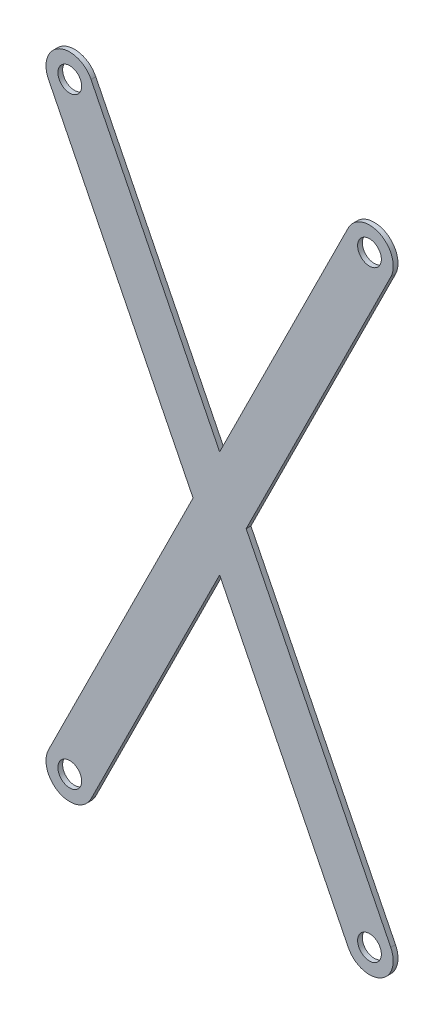
ISO-10303-21;
HEADER;
FILE_DESCRIPTION(('STEP AP214'),'2;1');
FILE_NAME('part.step','',(''),(''),'','','');
FILE_SCHEMA(('AUTOMOTIVE_DESIGN { 1 0 10303 214 1 1 1 1 }'));
ENDSEC;
DATA;
#1=APPLICATION_CONTEXT('core data for automotive mechanical design processes');
#2=APPLICATION_PROTOCOL_DEFINITION('international standard','automotive_design',2000,#1);
#3=PRODUCT_CONTEXT('',#1,'mechanical');
#4=PRODUCT('Part','Part','',(#3));
#5=PRODUCT_RELATED_PRODUCT_CATEGORY('part','',(#4));
#6=PRODUCT_DEFINITION_FORMATION('','',#4);
#7=PRODUCT_DEFINITION_CONTEXT('part definition',#1,'design');
#8=PRODUCT_DEFINITION('design','',#6,#7);
#9=PRODUCT_DEFINITION_SHAPE('','',#8);
#10=(LENGTH_UNIT() NAMED_UNIT(*) SI_UNIT(.MILLI.,.METRE.));
#11=(NAMED_UNIT(*) PLANE_ANGLE_UNIT() SI_UNIT($,.RADIAN.));
#12=(NAMED_UNIT(*) SI_UNIT($,.STERADIAN.) SOLID_ANGLE_UNIT());
#13=UNCERTAINTY_MEASURE_WITH_UNIT(LENGTH_MEASURE(1.E-05),#10,'distance_accuracy_value','');
#14=(GEOMETRIC_REPRESENTATION_CONTEXT(3) GLOBAL_UNCERTAINTY_ASSIGNED_CONTEXT((#13)) GLOBAL_UNIT_ASSIGNED_CONTEXT((#10,
#11,#12)) REPRESENTATION_CONTEXT('',''));
#15=CARTESIAN_POINT('',(0.,0.,0.));
#16=DIRECTION('',(0.,0.,1.));
#17=DIRECTION('',(1.,0.,0.));
#18=AXIS2_PLACEMENT_3D('',#15,#16,#17);
#19=CARTESIAN_POINT('',(0.,0.,3.));
#20=DIRECTION('',(0.,0.,1.));
#21=DIRECTION('',(1.,0.,0.));
#22=AXIS2_PLACEMENT_3D('',#19,#20,#21);
#23=PLANE('',#22);
#24=CARTESIAN_POINT('',(189.2634,-2.22044604925031E-13,3.));
#25=DIRECTION('',(0.,0.,1.));
#26=DIRECTION('',(1.,0.,0.));
#27=AXIS2_PLACEMENT_3D('',#24,#25,#26);
#28=CIRCLE('',#27,7.50000000000001);
#29=CARTESIAN_POINT('',(196.7634,-2.22044604925031E-13,3.));
#30=VERTEX_POINT('',#29);
#31=EDGE_CURVE('E293',#30,#30,#28,.T.);
#32=ORIENTED_EDGE('',*,*,#31,.F.);
#33=EDGE_LOOP('',(#32));
#34=FACE_BOUND('',#33,.T.);
#35=CARTESIAN_POINT('',(0.,-2.22044604925031E-13,3.));
#36=DIRECTION('',(0.,0.,1.));
#37=DIRECTION('',(1.,0.,0.));
#38=AXIS2_PLACEMENT_3D('',#35,#36,#37);
#39=CIRCLE('',#38,7.5);
#40=CARTESIAN_POINT('',(7.50000000000003,-2.22044604925031E-13,3.));
#41=VERTEX_POINT('',#40);
#42=EDGE_CURVE('E160',#41,#41,#39,.T.);
#43=ORIENTED_EDGE('',*,*,#42,.F.);
#44=EDGE_LOOP('',(#43));
#45=FACE_BOUND('',#44,.T.);
#46=CARTESIAN_POINT('',(0.,0.,3.));
#47=DIRECTION('',(0.,0.,1.));
#48=DIRECTION('',(1.,0.,0.));
#49=AXIS2_PLACEMENT_3D('',#46,#47,#48);
#50=CIRCLE('',#49,15.);
#51=CARTESIAN_POINT('',(-13.4268024267936,6.68737441690315,3.));
#52=VERTEX_POINT('',#51);
#53=CARTESIAN_POINT('',(13.4268024267936,-6.68737441690315,3.));
#54=VERTEX_POINT('',#53);
#55=EDGE_CURVE('E179',#52,#54,#50,.T.);
#56=ORIENTED_EDGE('',*,*,#55,.T.);
#57=DIRECTION('',(0.445824961126876,0.895120161786237,0.));
#58=VECTOR('',#57,1.);
#59=CARTESIAN_POINT('',(13.4268024267936,-6.68737441690315,3.));
#60=LINE('',#59,#58);
#61=CARTESIAN_POINT('',(94.6316999999998,156.354508365602,3.));
#62=VERTEX_POINT('',#61);
#63=EDGE_CURVE('E107',#54,#62,#60,.T.);
#64=ORIENTED_EDGE('',*,*,#63,.T.);
#65=DIRECTION('',(0.445824961126877,-0.895120161786237,0.));
#66=VECTOR('',#65,1.);
#67=CARTESIAN_POINT('',(94.6316999999998,156.354508365602,3.));
#68=LINE('',#67,#66);
#69=CARTESIAN_POINT('',(175.836597573206,-6.68737441690336,3.));
#70=VERTEX_POINT('',#69);
#71=EDGE_CURVE('E206',#62,#70,#68,.T.);
#72=ORIENTED_EDGE('',*,*,#71,.T.);
#73=CARTESIAN_POINT('',(189.2634,-1.94289029309402E-13,3.));
#74=DIRECTION('',(0.,0.,1.));
#75=DIRECTION('',(1.,0.,0.));
#76=AXIS2_PLACEMENT_3D('',#73,#74,#75);
#77=CIRCLE('',#76,15.);
#78=CARTESIAN_POINT('',(202.690202426793,6.68737441690293,3.));
#79=VERTEX_POINT('',#78);
#80=EDGE_CURVE('E225',#70,#79,#77,.T.);
#81=ORIENTED_EDGE('',*,*,#80,.T.);
#82=DIRECTION('',(-0.445824961126877,0.895120161786237,0.));
#83=VECTOR('',#82,1.);
#84=CARTESIAN_POINT('',(111.389226687888,190.,3.));
#85=LINE('',#84,#83);
#86=CARTESIAN_POINT('',(111.389226687888,190.,3.));
#87=VERTEX_POINT('',#86);
#88=EDGE_CURVE('E222',#79,#87,#85,.T.);
#89=ORIENTED_EDGE('',*,*,#88,.T.);
#90=DIRECTION('',(0.445824961126876,0.895120161786237,0.));
#91=VECTOR('',#90,1.);
#92=CARTESIAN_POINT('',(111.389226687888,190.,3.));
#93=LINE('',#92,#91);
#94=CARTESIAN_POINT('',(202.690202426793,373.312625583097,3.));
#95=VERTEX_POINT('',#94);
#96=EDGE_CURVE('E224',#87,#95,#93,.T.);
#97=ORIENTED_EDGE('',*,*,#96,.T.);
#98=CARTESIAN_POINT('',(189.2634,380.,3.));
#99=DIRECTION('',(0.,0.,1.));
#100=DIRECTION('',(1.,0.,0.));
#101=AXIS2_PLACEMENT_3D('',#98,#99,#100);
#102=CIRCLE('',#101,15.);
#103=CARTESIAN_POINT('',(175.836597573206,386.687374416903,3.));
#104=VERTEX_POINT('',#103);
#105=EDGE_CURVE('E227',#95,#104,#102,.T.);
#106=ORIENTED_EDGE('',*,*,#105,.T.);
#107=DIRECTION('',(-0.445824961126876,-0.895120161786237,0.));
#108=VECTOR('',#107,1.);
#109=CARTESIAN_POINT('',(94.6316999999998,223.645491634397,3.));
#110=LINE('',#109,#108);
#111=CARTESIAN_POINT('',(94.6316999999998,223.645491634397,3.));
#112=VERTEX_POINT('',#111);
#113=EDGE_CURVE('E233',#104,#112,#110,.T.);
#114=ORIENTED_EDGE('',*,*,#113,.T.);
#115=DIRECTION('',(-0.445824961126877,0.895120161786237,0.));
#116=VECTOR('',#115,1.);
#117=CARTESIAN_POINT('',(13.4268024267935,386.687374416903,3.));
#118=LINE('',#117,#116);
#119=CARTESIAN_POINT('',(13.4268024267935,386.687374416903,3.));
#120=VERTEX_POINT('',#119);
#121=EDGE_CURVE('E138',#112,#120,#118,.T.);
#122=ORIENTED_EDGE('',*,*,#121,.T.);
#123=CARTESIAN_POINT('',(0.,380.,3.));
#124=DIRECTION('',(0.,0.,1.));
#125=DIRECTION('',(1.,0.,0.));
#126=AXIS2_PLACEMENT_3D('',#123,#124,#125);
#127=CIRCLE('',#126,15.);
#128=CARTESIAN_POINT('',(-13.4268024267936,373.312625583097,3.));
#129=VERTEX_POINT('',#128);
#130=EDGE_CURVE('E132',#120,#129,#127,.T.);
#131=ORIENTED_EDGE('',*,*,#130,.T.);
#132=DIRECTION('',(0.445824961126877,-0.895120161786237,0.));
#133=VECTOR('',#132,1.);
#134=CARTESIAN_POINT('',(-13.4268024267936,373.312625583097,3.));
#135=LINE('',#134,#133);
#136=CARTESIAN_POINT('',(77.8741733121112,190.,3.));
#137=VERTEX_POINT('',#136);
#138=EDGE_CURVE('E136',#129,#137,#135,.T.);
#139=ORIENTED_EDGE('',*,*,#138,.T.);
#140=DIRECTION('',(-0.445824961126876,-0.895120161786237,0.));
#141=VECTOR('',#140,1.);
#142=CARTESIAN_POINT('',(-13.4268024267936,6.68737441690315,3.));
#143=LINE('',#142,#141);
#144=EDGE_CURVE('E52',#137,#52,#143,.T.);
#145=ORIENTED_EDGE('',*,*,#144,.T.);
#146=EDGE_LOOP('',(#56,#64,#72,#81,#89,#97,#106,#114,#122,#131,#139,#145));
#147=FACE_BOUND('',#146,.T.);
#148=CARTESIAN_POINT('',(189.2634,380.,3.));
#149=DIRECTION('',(0.,0.,1.));
#150=DIRECTION('',(1.,0.,0.));
#151=AXIS2_PLACEMENT_3D('',#148,#149,#150);
#152=CIRCLE('',#151,7.50000000000001);
#153=CARTESIAN_POINT('',(196.7634,380.,3.));
#154=VERTEX_POINT('',#153);
#155=EDGE_CURVE('E299',#154,#154,#152,.T.);
#156=ORIENTED_EDGE('',*,*,#155,.F.);
#157=EDGE_LOOP('',(#156));
#158=FACE_BOUND('',#157,.T.);
#159=CARTESIAN_POINT('',(0.,380.,3.));
#160=DIRECTION('',(0.,0.,1.));
#161=DIRECTION('',(1.,0.,0.));
#162=AXIS2_PLACEMENT_3D('',#159,#160,#161);
#163=CIRCLE('',#162,7.5);
#164=CARTESIAN_POINT('',(7.49999999999992,380.,3.));
#165=VERTEX_POINT('',#164);
#166=EDGE_CURVE('E284',#165,#165,#163,.T.);
#167=ORIENTED_EDGE('',*,*,#166,.F.);
#168=EDGE_LOOP('',(#167));
#169=FACE_BOUND('',#168,.T.);
#170=ADVANCED_FACE('F35',(#34,#45,#147,#158,#169),#23,.T.);
#171=CARTESIAN_POINT('',(0.,0.,0.));
#172=DIRECTION('',(0.,0.,1.));
#173=DIRECTION('',(1.,0.,0.));
#174=AXIS2_PLACEMENT_3D('',#171,#172,#173);
#175=PLANE('',#174);
#176=CARTESIAN_POINT('',(0.,0.,0.));
#177=DIRECTION('',(0.,0.,1.));
#178=DIRECTION('',(1.,0.,0.));
#179=AXIS2_PLACEMENT_3D('',#176,#177,#178);
#180=CIRCLE('',#179,15.);
#181=CARTESIAN_POINT('',(-13.4268024267936,6.68737441690315,0.));
#182=VERTEX_POINT('',#181);
#183=CARTESIAN_POINT('',(13.4268024267936,-6.68737441690315,0.));
#184=VERTEX_POINT('',#183);
#185=EDGE_CURVE('E156',#182,#184,#180,.T.);
#186=ORIENTED_EDGE('',*,*,#185,.F.);
#187=DIRECTION('',(-0.445824961126876,-0.895120161786237,0.));
#188=VECTOR('',#187,1.);
#189=CARTESIAN_POINT('',(-13.4268024267936,6.68737441690315,0.));
#190=LINE('',#189,#188);
#191=CARTESIAN_POINT('',(77.8741733121112,190.,0.));
#192=VERTEX_POINT('',#191);
#193=EDGE_CURVE('E99',#192,#182,#190,.T.);
#194=ORIENTED_EDGE('',*,*,#193,.F.);
#195=DIRECTION('',(0.445824961126877,-0.895120161786237,0.));
#196=VECTOR('',#195,1.);
#197=CARTESIAN_POINT('',(-13.4268024267936,373.312625583097,0.));
#198=LINE('',#197,#196);
#199=CARTESIAN_POINT('',(-13.4268024267936,373.312625583097,0.));
#200=VERTEX_POINT('',#199);
#201=EDGE_CURVE('E93',#200,#192,#198,.T.);
#202=ORIENTED_EDGE('',*,*,#201,.F.);
#203=CARTESIAN_POINT('',(0.,380.,0.));
#204=DIRECTION('',(0.,0.,1.));
#205=DIRECTION('',(1.,0.,0.));
#206=AXIS2_PLACEMENT_3D('',#203,#204,#205);
#207=CIRCLE('',#206,15.);
#208=CARTESIAN_POINT('',(13.4268024267935,386.687374416903,0.));
#209=VERTEX_POINT('',#208);
#210=EDGE_CURVE('E146',#209,#200,#207,.T.);
#211=ORIENTED_EDGE('',*,*,#210,.F.);
#212=DIRECTION('',(-0.445824961126877,0.895120161786237,0.));
#213=VECTOR('',#212,1.);
#214=CARTESIAN_POINT('',(13.4268024267935,386.687374416903,0.));
#215=LINE('',#214,#213);
#216=CARTESIAN_POINT('',(94.6316999999998,223.645491634397,0.));
#217=VERTEX_POINT('',#216);
#218=EDGE_CURVE('E174',#217,#209,#215,.T.);
#219=ORIENTED_EDGE('',*,*,#218,.F.);
#220=DIRECTION('',(-0.445824961126876,-0.895120161786237,0.));
#221=VECTOR('',#220,1.);
#222=CARTESIAN_POINT('',(94.6316999999998,223.645491634397,0.));
#223=LINE('',#222,#221);
#224=CARTESIAN_POINT('',(175.836597573206,386.687374416903,0.));
#225=VERTEX_POINT('',#224);
#226=EDGE_CURVE('E172',#225,#217,#223,.T.);
#227=ORIENTED_EDGE('',*,*,#226,.F.);
#228=CARTESIAN_POINT('',(189.2634,380.,0.));
#229=DIRECTION('',(0.,0.,1.));
#230=DIRECTION('',(1.,0.,0.));
#231=AXIS2_PLACEMENT_3D('',#228,#229,#230);
#232=CIRCLE('',#231,15.);
#233=CARTESIAN_POINT('',(202.690202426793,373.312625583097,0.));
#234=VERTEX_POINT('',#233);
#235=EDGE_CURVE('E170',#234,#225,#232,.T.);
#236=ORIENTED_EDGE('',*,*,#235,.F.);
#237=DIRECTION('',(0.445824961126876,0.895120161786237,0.));
#238=VECTOR('',#237,1.);
#239=CARTESIAN_POINT('',(111.389226687888,190.,0.));
#240=LINE('',#239,#238);
#241=CARTESIAN_POINT('',(111.389226687888,190.,0.));
#242=VERTEX_POINT('',#241);
#243=EDGE_CURVE('E168',#242,#234,#240,.T.);
#244=ORIENTED_EDGE('',*,*,#243,.F.);
#245=DIRECTION('',(-0.445824961126877,0.895120161786237,0.));
#246=VECTOR('',#245,1.);
#247=CARTESIAN_POINT('',(111.389226687888,190.,0.));
#248=LINE('',#247,#246);
#249=CARTESIAN_POINT('',(202.690202426793,6.68737441690293,0.));
#250=VERTEX_POINT('',#249);
#251=EDGE_CURVE('E166',#250,#242,#248,.T.);
#252=ORIENTED_EDGE('',*,*,#251,.F.);
#253=CARTESIAN_POINT('',(189.2634,-1.94289029309402E-13,0.));
#254=DIRECTION('',(0.,0.,1.));
#255=DIRECTION('',(1.,0.,0.));
#256=AXIS2_PLACEMENT_3D('',#253,#254,#255);
#257=CIRCLE('',#256,15.);
#258=CARTESIAN_POINT('',(175.836597573206,-6.68737441690336,0.));
#259=VERTEX_POINT('',#258);
#260=EDGE_CURVE('E164',#259,#250,#257,.T.);
#261=ORIENTED_EDGE('',*,*,#260,.F.);
#262=DIRECTION('',(0.445824961126877,-0.895120161786237,0.));
#263=VECTOR('',#262,1.);
#264=CARTESIAN_POINT('',(94.6316999999998,156.354508365602,0.));
#265=LINE('',#264,#263);
#266=CARTESIAN_POINT('',(94.6316999999998,156.354508365602,0.));
#267=VERTEX_POINT('',#266);
#268=EDGE_CURVE('E162',#267,#259,#265,.T.);
#269=ORIENTED_EDGE('',*,*,#268,.F.);
#270=DIRECTION('',(0.445824961126876,0.895120161786237,0.));
#271=VECTOR('',#270,1.);
#272=CARTESIAN_POINT('',(13.4268024267936,-6.68737441690315,0.));
#273=LINE('',#272,#271);
#274=EDGE_CURVE('E159',#184,#267,#273,.T.);
#275=ORIENTED_EDGE('',*,*,#274,.F.);
#276=EDGE_LOOP('',(#186,#194,#202,#211,#219,#227,#236,#244,#252,#261,#269,#275));
#277=FACE_BOUND('',#276,.T.);
#278=CARTESIAN_POINT('',(0.,-2.22044604925031E-13,0.));
#279=DIRECTION('',(0.,0.,1.));
#280=DIRECTION('',(1.,0.,0.));
#281=AXIS2_PLACEMENT_3D('',#278,#279,#280);
#282=CIRCLE('',#281,7.5);
#283=CARTESIAN_POINT('',(7.50000000000003,-2.22044604925031E-13,0.));
#284=VERTEX_POINT('',#283);
#285=EDGE_CURVE('E302',#284,#284,#282,.T.);
#286=ORIENTED_EDGE('',*,*,#285,.T.);
#287=EDGE_LOOP('',(#286));
#288=FACE_BOUND('',#287,.T.);
#289=CARTESIAN_POINT('',(189.2634,380.,0.));
#290=DIRECTION('',(0.,0.,1.));
#291=DIRECTION('',(1.,0.,0.));
#292=AXIS2_PLACEMENT_3D('',#289,#290,#291);
#293=CIRCLE('',#292,7.50000000000001);
#294=CARTESIAN_POINT('',(196.7634,380.,0.));
#295=VERTEX_POINT('',#294);
#296=EDGE_CURVE('E296',#295,#295,#293,.T.);
#297=ORIENTED_EDGE('',*,*,#296,.T.);
#298=EDGE_LOOP('',(#297));
#299=FACE_BOUND('',#298,.T.);
#300=CARTESIAN_POINT('',(189.2634,-2.22044604925031E-13,0.));
#301=DIRECTION('',(0.,0.,1.));
#302=DIRECTION('',(1.,0.,0.));
#303=AXIS2_PLACEMENT_3D('',#300,#301,#302);
#304=CIRCLE('',#303,7.50000000000001);
#305=CARTESIAN_POINT('',(196.7634,-2.22044604925031E-13,0.));
#306=VERTEX_POINT('',#305);
#307=EDGE_CURVE('E290',#306,#306,#304,.T.);
#308=ORIENTED_EDGE('',*,*,#307,.T.);
#309=EDGE_LOOP('',(#308));
#310=FACE_BOUND('',#309,.T.);
#311=CARTESIAN_POINT('',(0.,380.,0.));
#312=DIRECTION('',(0.,0.,1.));
#313=DIRECTION('',(1.,0.,0.));
#314=AXIS2_PLACEMENT_3D('',#311,#312,#313);
#315=CIRCLE('',#314,7.5);
#316=CARTESIAN_POINT('',(7.49999999999992,380.,0.));
#317=VERTEX_POINT('',#316);
#318=EDGE_CURVE('E287',#317,#317,#315,.T.);
#319=ORIENTED_EDGE('',*,*,#318,.T.);
#320=EDGE_LOOP('',(#319));
#321=FACE_BOUND('',#320,.T.);
#322=ADVANCED_FACE('F210',(#277,#288,#299,#310,#321),#175,.F.);
#323=CARTESIAN_POINT('',(0.,0.,3.));
#324=DIRECTION('',(0.,0.,-1.));
#325=DIRECTION('',(-1.,0.,0.));
#326=AXIS2_PLACEMENT_3D('',#323,#324,#325);
#327=CYLINDRICAL_SURFACE('',#326,15.);
#328=ORIENTED_EDGE('',*,*,#185,.T.);
#329=DIRECTION('',(0.,0.,-1.));
#330=VECTOR('',#329,1.);
#331=CARTESIAN_POINT('',(13.4268024267936,-6.68737441690315,3.));
#332=LINE('',#331,#330);
#333=EDGE_CURVE('E11',#54,#184,#332,.T.);
#334=ORIENTED_EDGE('',*,*,#333,.F.);
#335=ORIENTED_EDGE('',*,*,#55,.F.);
#336=DIRECTION('',(0.,0.,-1.));
#337=VECTOR('',#336,1.);
#338=CARTESIAN_POINT('',(-13.4268024267936,6.68737441690315,3.));
#339=LINE('',#338,#337);
#340=EDGE_CURVE('E152',#52,#182,#339,.T.);
#341=ORIENTED_EDGE('',*,*,#340,.T.);
#342=EDGE_LOOP('',(#328,#334,#335,#341));
#343=FACE_BOUND('',#342,.T.);
#344=ADVANCED_FACE('F37',(#343),#327,.T.);
#345=CARTESIAN_POINT('',(13.4268024267936,-6.68737441690315,3.));
#346=DIRECTION('',(-0.895120161786237,0.445824961126876,0.));
#347=DIRECTION('',(-0.445824961126876,-0.895120161786237,0.));
#348=AXIS2_PLACEMENT_3D('',#345,#346,#347);
#349=PLANE('',#348);
#350=ORIENTED_EDGE('',*,*,#274,.T.);
#351=DIRECTION('',(0.,0.,-1.));
#352=VECTOR('',#351,1.);
#353=CARTESIAN_POINT('',(94.6316999999998,156.354508365602,3.));
#354=LINE('',#353,#352);
#355=EDGE_CURVE('E44',#62,#267,#354,.T.);
#356=ORIENTED_EDGE('',*,*,#355,.F.);
#357=ORIENTED_EDGE('',*,*,#63,.F.);
#358=ORIENTED_EDGE('',*,*,#333,.T.);
#359=EDGE_LOOP('',(#350,#356,#357,#358));
#360=FACE_BOUND('',#359,.T.);
#361=ADVANCED_FACE('F412',(#360),#349,.F.);
#362=CARTESIAN_POINT('',(94.6316999999998,156.354508365602,3.));
#363=DIRECTION('',(0.895120161786237,0.445824961126877,0.));
#364=DIRECTION('',(-0.445824961126877,0.895120161786237,0.));
#365=AXIS2_PLACEMENT_3D('',#362,#363,#364);
#366=PLANE('',#365);
#367=ORIENTED_EDGE('',*,*,#268,.T.);
#368=DIRECTION('',(0.,0.,-1.));
#369=VECTOR('',#368,1.);
#370=CARTESIAN_POINT('',(175.836597573206,-6.68737441690336,3.));
#371=LINE('',#370,#369);
#372=EDGE_CURVE('E198',#70,#259,#371,.T.);
#373=ORIENTED_EDGE('',*,*,#372,.F.);
#374=ORIENTED_EDGE('',*,*,#71,.F.);
#375=ORIENTED_EDGE('',*,*,#355,.T.);
#376=EDGE_LOOP('',(#367,#373,#374,#375));
#377=FACE_BOUND('',#376,.T.);
#378=ADVANCED_FACE('F204',(#377),#366,.F.);
#379=CARTESIAN_POINT('',(189.2634,-1.94289029309402E-13,3.));
#380=DIRECTION('',(0.,0.,-1.));
#381=DIRECTION('',(-1.,0.,0.));
#382=AXIS2_PLACEMENT_3D('',#379,#380,#381);
#383=CYLINDRICAL_SURFACE('',#382,15.);
#384=ORIENTED_EDGE('',*,*,#260,.T.);
#385=DIRECTION('',(0.,0.,-1.));
#386=VECTOR('',#385,1.);
#387=CARTESIAN_POINT('',(202.690202426793,6.68737441690293,3.));
#388=LINE('',#387,#386);
#389=EDGE_CURVE('E195',#79,#250,#388,.T.);
#390=ORIENTED_EDGE('',*,*,#389,.F.);
#391=ORIENTED_EDGE('',*,*,#80,.F.);
#392=ORIENTED_EDGE('',*,*,#372,.T.);
#393=EDGE_LOOP('',(#384,#390,#391,#392));
#394=FACE_BOUND('',#393,.T.);
#395=ADVANCED_FACE('F216',(#394),#383,.T.);
#396=CARTESIAN_POINT('',(111.389226687888,190.,3.));
#397=DIRECTION('',(-0.895120161786237,-0.445824961126877,0.));
#398=DIRECTION('',(0.445824961126877,-0.895120161786237,0.));
#399=AXIS2_PLACEMENT_3D('',#396,#397,#398);
#400=PLANE('',#399);
#401=ORIENTED_EDGE('',*,*,#251,.T.);
#402=DIRECTION('',(0.,0.,-1.));
#403=VECTOR('',#402,1.);
#404=CARTESIAN_POINT('',(111.389226687888,190.,3.));
#405=LINE('',#404,#403);
#406=EDGE_CURVE('E192',#87,#242,#405,.T.);
#407=ORIENTED_EDGE('',*,*,#406,.F.);
#408=ORIENTED_EDGE('',*,*,#88,.F.);
#409=ORIENTED_EDGE('',*,*,#389,.T.);
#410=EDGE_LOOP('',(#401,#407,#408,#409));
#411=FACE_BOUND('',#410,.T.);
#412=ADVANCED_FACE('F220',(#411),#400,.F.);
#413=CARTESIAN_POINT('',(111.389226687888,190.,3.));
#414=DIRECTION('',(-0.895120161786237,0.445824961126876,0.));
#415=DIRECTION('',(-0.445824961126876,-0.895120161786237,0.));
#416=AXIS2_PLACEMENT_3D('',#413,#414,#415);
#417=PLANE('',#416);
#418=ORIENTED_EDGE('',*,*,#243,.T.);
#419=DIRECTION('',(0.,0.,-1.));
#420=VECTOR('',#419,1.);
#421=CARTESIAN_POINT('',(202.690202426793,373.312625583097,3.));
#422=LINE('',#421,#420);
#423=EDGE_CURVE('E189',#95,#234,#422,.T.);
#424=ORIENTED_EDGE('',*,*,#423,.F.);
#425=ORIENTED_EDGE('',*,*,#96,.F.);
#426=ORIENTED_EDGE('',*,*,#406,.T.);
#427=EDGE_LOOP('',(#418,#424,#425,#426));
#428=FACE_BOUND('',#427,.T.);
#429=ADVANCED_FACE('F377',(#428),#417,.F.);
#430=CARTESIAN_POINT('',(189.2634,380.,3.));
#431=DIRECTION('',(0.,0.,-1.));
#432=DIRECTION('',(-1.,0.,0.));
#433=AXIS2_PLACEMENT_3D('',#430,#431,#432);
#434=CYLINDRICAL_SURFACE('',#433,15.);
#435=ORIENTED_EDGE('',*,*,#235,.T.);
#436=DIRECTION('',(0.,0.,-1.));
#437=VECTOR('',#436,1.);
#438=CARTESIAN_POINT('',(175.836597573206,386.687374416903,3.));
#439=LINE('',#438,#437);
#440=EDGE_CURVE('E186',#104,#225,#439,.T.);
#441=ORIENTED_EDGE('',*,*,#440,.F.);
#442=ORIENTED_EDGE('',*,*,#105,.F.);
#443=ORIENTED_EDGE('',*,*,#423,.T.);
#444=EDGE_LOOP('',(#435,#441,#442,#443));
#445=FACE_BOUND('',#444,.T.);
#446=ADVANCED_FACE('F368',(#445),#434,.T.);
#447=CARTESIAN_POINT('',(94.6316999999998,223.645491634397,3.));
#448=DIRECTION('',(0.895120161786237,-0.445824961126876,0.));
#449=DIRECTION('',(0.445824961126876,0.895120161786237,0.));
#450=AXIS2_PLACEMENT_3D('',#447,#448,#449);
#451=PLANE('',#450);
#452=ORIENTED_EDGE('',*,*,#226,.T.);
#453=DIRECTION('',(0.,0.,-1.));
#454=VECTOR('',#453,1.);
#455=CARTESIAN_POINT('',(94.6316999999998,223.645491634397,3.));
#456=LINE('',#455,#454);
#457=EDGE_CURVE('E183',#112,#217,#456,.T.);
#458=ORIENTED_EDGE('',*,*,#457,.F.);
#459=ORIENTED_EDGE('',*,*,#113,.F.);
#460=ORIENTED_EDGE('',*,*,#440,.T.);
#461=EDGE_LOOP('',(#452,#458,#459,#460));
#462=FACE_BOUND('',#461,.T.);
#463=ADVANCED_FACE('F239',(#462),#451,.F.);
#464=CARTESIAN_POINT('',(13.4268024267935,386.687374416903,3.));
#465=DIRECTION('',(-0.895120161786237,-0.445824961126877,0.));
#466=DIRECTION('',(0.445824961126877,-0.895120161786237,0.));
#467=AXIS2_PLACEMENT_3D('',#464,#465,#466);
#468=PLANE('',#467);
#469=ORIENTED_EDGE('',*,*,#218,.T.);
#470=DIRECTION('',(0.,0.,-1.));
#471=VECTOR('',#470,1.);
#472=CARTESIAN_POINT('',(13.4268024267935,386.687374416903,3.));
#473=LINE('',#472,#471);
#474=EDGE_CURVE('E147',#120,#209,#473,.T.);
#475=ORIENTED_EDGE('',*,*,#474,.F.);
#476=ORIENTED_EDGE('',*,*,#121,.F.);
#477=ORIENTED_EDGE('',*,*,#457,.T.);
#478=EDGE_LOOP('',(#469,#475,#476,#477));
#479=FACE_BOUND('',#478,.T.);
#480=ADVANCED_FACE('F243',(#479),#468,.F.);
#481=CARTESIAN_POINT('',(0.,380.,3.));
#482=DIRECTION('',(0.,0.,-1.));
#483=DIRECTION('',(-1.,0.,0.));
#484=AXIS2_PLACEMENT_3D('',#481,#482,#483);
#485=CYLINDRICAL_SURFACE('',#484,15.);
#486=ORIENTED_EDGE('',*,*,#210,.T.);
#487=DIRECTION('',(0.,0.,-1.));
#488=VECTOR('',#487,1.);
#489=CARTESIAN_POINT('',(-13.4268024267936,373.312625583097,3.));
#490=LINE('',#489,#488);
#491=EDGE_CURVE('E143',#129,#200,#490,.T.);
#492=ORIENTED_EDGE('',*,*,#491,.F.);
#493=ORIENTED_EDGE('',*,*,#130,.F.);
#494=ORIENTED_EDGE('',*,*,#474,.T.);
#495=EDGE_LOOP('',(#486,#492,#493,#494));
#496=FACE_BOUND('',#495,.T.);
#497=ADVANCED_FACE('F144',(#496),#485,.T.);
#498=CARTESIAN_POINT('',(-13.4268024267936,373.312625583097,3.));
#499=DIRECTION('',(0.895120161786237,0.445824961126877,0.));
#500=DIRECTION('',(-0.445824961126877,0.895120161786237,0.));
#501=AXIS2_PLACEMENT_3D('',#498,#499,#500);
#502=PLANE('',#501);
#503=ORIENTED_EDGE('',*,*,#201,.T.);
#504=DIRECTION('',(0.,0.,-1.));
#505=VECTOR('',#504,1.);
#506=CARTESIAN_POINT('',(77.8741733121112,190.,3.));
#507=LINE('',#506,#505);
#508=EDGE_CURVE('E148',#137,#192,#507,.T.);
#509=ORIENTED_EDGE('',*,*,#508,.F.);
#510=ORIENTED_EDGE('',*,*,#138,.F.);
#511=ORIENTED_EDGE('',*,*,#491,.T.);
#512=EDGE_LOOP('',(#503,#509,#510,#511));
#513=FACE_BOUND('',#512,.T.);
#514=ADVANCED_FACE('F150',(#513),#502,.F.);
#515=CARTESIAN_POINT('',(-13.4268024267936,6.68737441690315,3.));
#516=DIRECTION('',(0.895120161786237,-0.445824961126876,0.));
#517=DIRECTION('',(0.445824961126876,0.895120161786237,0.));
#518=AXIS2_PLACEMENT_3D('',#515,#516,#517);
#519=PLANE('',#518);
#520=ORIENTED_EDGE('',*,*,#193,.T.);
#521=ORIENTED_EDGE('',*,*,#340,.F.);
#522=ORIENTED_EDGE('',*,*,#144,.F.);
#523=ORIENTED_EDGE('',*,*,#508,.T.);
#524=EDGE_LOOP('',(#520,#521,#522,#523));
#525=FACE_BOUND('',#524,.T.);
#526=ADVANCED_FACE('F247',(#525),#519,.F.);
#527=CARTESIAN_POINT('',(0.,-2.22044604925031E-13,3.));
#528=DIRECTION('',(0.,0.,-1.));
#529=DIRECTION('',(-1.,0.,0.));
#530=AXIS2_PLACEMENT_3D('',#527,#528,#529);
#531=CYLINDRICAL_SURFACE('',#530,7.5);
#532=ORIENTED_EDGE('',*,*,#42,.T.);
#533=EDGE_LOOP('',(#532));
#534=FACE_BOUND('',#533,.T.);
#535=ORIENTED_EDGE('',*,*,#285,.F.);
#536=EDGE_LOOP('',(#535));
#537=FACE_BOUND('',#536,.T.);
#538=ADVANCED_FACE('F249',(#534,#537),#531,.F.);
#539=CARTESIAN_POINT('',(189.2634,380.,3.));
#540=DIRECTION('',(0.,0.,-1.));
#541=DIRECTION('',(-1.,0.,0.));
#542=AXIS2_PLACEMENT_3D('',#539,#540,#541);
#543=CYLINDRICAL_SURFACE('',#542,7.50000000000001);
#544=ORIENTED_EDGE('',*,*,#155,.T.);
#545=EDGE_LOOP('',(#544));
#546=FACE_BOUND('',#545,.T.);
#547=ORIENTED_EDGE('',*,*,#296,.F.);
#548=EDGE_LOOP('',(#547));
#549=FACE_BOUND('',#548,.T.);
#550=ADVANCED_FACE('F255',(#546,#549),#543,.F.);
#551=CARTESIAN_POINT('',(189.2634,-2.22044604925031E-13,3.));
#552=DIRECTION('',(0.,0.,-1.));
#553=DIRECTION('',(-1.,0.,0.));
#554=AXIS2_PLACEMENT_3D('',#551,#552,#553);
#555=CYLINDRICAL_SURFACE('',#554,7.50000000000001);
#556=ORIENTED_EDGE('',*,*,#31,.T.);
#557=EDGE_LOOP('',(#556));
#558=FACE_BOUND('',#557,.T.);
#559=ORIENTED_EDGE('',*,*,#307,.F.);
#560=EDGE_LOOP('',(#559));
#561=FACE_BOUND('',#560,.T.);
#562=ADVANCED_FACE('F271',(#558,#561),#555,.F.);
#563=CARTESIAN_POINT('',(0.,380.,3.));
#564=DIRECTION('',(0.,0.,-1.));
#565=DIRECTION('',(-1.,0.,0.));
#566=AXIS2_PLACEMENT_3D('',#563,#564,#565);
#567=CYLINDRICAL_SURFACE('',#566,7.5);
#568=ORIENTED_EDGE('',*,*,#166,.T.);
#569=EDGE_LOOP('',(#568));
#570=FACE_BOUND('',#569,.T.);
#571=ORIENTED_EDGE('',*,*,#318,.F.);
#572=EDGE_LOOP('',(#571));
#573=FACE_BOUND('',#572,.T.);
#574=ADVANCED_FACE('F275',(#570,#573),#567,.F.);
#575=CLOSED_SHELL('',(#170,#322,#344,#361,#378,#395,#412,#429,#446,#463,#480,#497,#514,#526,
#538,#550,#562,#574));
#576=MANIFOLD_SOLID_BREP('B2',#575);
#577=ADVANCED_BREP_SHAPE_REPRESENTATION('',(#18,#576),#14);
#578=SHAPE_DEFINITION_REPRESENTATION(#9,#577);
ENDSEC;
END-ISO-10303-21;
